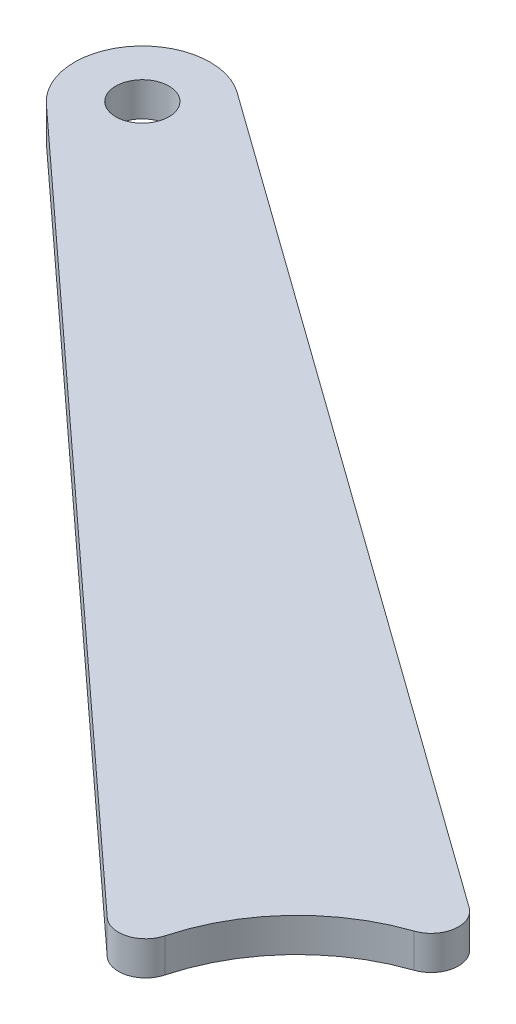
ISO-10303-21;
HEADER;
FILE_DESCRIPTION(('STEP AP214'),'2;1');
FILE_NAME('part.step','',(''),(''),'','','');
FILE_SCHEMA(('AUTOMOTIVE_DESIGN { 1 0 10303 214 1 1 1 1 }'));
ENDSEC;
DATA;
#1=APPLICATION_CONTEXT('core data for automotive mechanical design processes');
#2=APPLICATION_PROTOCOL_DEFINITION('international standard','automotive_design',2000,#1);
#3=PRODUCT_CONTEXT('',#1,'mechanical');
#4=PRODUCT('Part','Part','',(#3));
#5=PRODUCT_RELATED_PRODUCT_CATEGORY('part','',(#4));
#6=PRODUCT_DEFINITION_FORMATION('','',#4);
#7=PRODUCT_DEFINITION_CONTEXT('part definition',#1,'design');
#8=PRODUCT_DEFINITION('design','',#6,#7);
#9=PRODUCT_DEFINITION_SHAPE('','',#8);
#10=(LENGTH_UNIT() NAMED_UNIT(*) SI_UNIT(.MILLI.,.METRE.));
#11=(NAMED_UNIT(*) PLANE_ANGLE_UNIT() SI_UNIT($,.RADIAN.));
#12=(NAMED_UNIT(*) SI_UNIT($,.STERADIAN.) SOLID_ANGLE_UNIT());
#13=UNCERTAINTY_MEASURE_WITH_UNIT(LENGTH_MEASURE(1.E-05),#10,'distance_accuracy_value','');
#14=(GEOMETRIC_REPRESENTATION_CONTEXT(3) GLOBAL_UNCERTAINTY_ASSIGNED_CONTEXT((#13)) GLOBAL_UNIT_ASSIGNED_CONTEXT((#10,
#11,#12)) REPRESENTATION_CONTEXT('',''));
#15=CARTESIAN_POINT('',(0.,0.,0.));
#16=DIRECTION('',(0.,0.,1.));
#17=DIRECTION('',(1.,0.,0.));
#18=AXIS2_PLACEMENT_3D('',#15,#16,#17);
#19=CARTESIAN_POINT('',(-102.921960951703,3.175,-134.482288991755));
#20=DIRECTION('',(0.,1.,0.));
#21=DIRECTION('',(0.,0.,1.));
#22=AXIS2_PLACEMENT_3D('',#19,#20,#21);
#23=PLANE('',#22);
#24=CARTESIAN_POINT('',(-102.921960951703,3.175,-134.482288991755));
#25=DIRECTION('',(0.,1.,0.));
#26=DIRECTION('',(0.,0.,1.));
#27=AXIS2_PLACEMENT_3D('',#24,#25,#26);
#28=CIRCLE('',#27,6.34999999999998);
#29=CARTESIAN_POINT('',(-99.2193740859753,3.175,-139.641101888317));
#30=VERTEX_POINT('',#29);
#31=CARTESIAN_POINT('',(-107.214132468825,3.175,-129.802570659675));
#32=VERTEX_POINT('',#31);
#33=EDGE_CURVE('E135',#30,#32,#28,.T.);
#34=ORIENTED_EDGE('',*,*,#33,.T.);
#35=DIRECTION('',(0.736963516863045,0.,0.675932522381379));
#36=VECTOR('',#35,1.);
#37=CARTESIAN_POINT('',(-107.214132468825,3.175,-129.802570659675));
#38=LINE('',#37,#36);
#39=CARTESIAN_POINT('',(-38.5058667050716,3.175,-66.7843203345713));
#40=VERTEX_POINT('',#39);
#41=EDGE_CURVE('E93',#32,#40,#38,.T.);
#42=ORIENTED_EDGE('',*,*,#41,.T.);
#43=CARTESIAN_POINT('',(-36.7889980982229,3.175,-68.6562076674035));
#44=DIRECTION('',(0.,1.,0.));
#45=DIRECTION('',(0.,0.,1.));
#46=AXIS2_PLACEMENT_3D('',#43,#44,#45);
#47=CIRCLE('',#46,2.53999999999999);
#48=CARTESIAN_POINT('',(-34.3348396095597,3.175,-68.0014511382094));
#49=VERTEX_POINT('',#48);
#50=EDGE_CURVE('E106',#40,#49,#47,.T.);
#51=ORIENTED_EDGE('',*,*,#50,.T.);
#52=CARTESIAN_POINT('',(-17.4625000000001,3.175,-63.5));
#53=DIRECTION('',(0.,-1.,0.));
#54=DIRECTION('',(0.,0.,1.));
#55=AXIS2_PLACEMENT_3D('',#52,#53,#54);
#56=CIRCLE('',#55,17.4625);
#57=CARTESIAN_POINT('',(-23.0676345839141,3.175,-80.0384815671273));
#58=VERTEX_POINT('',#57);
#59=EDGE_CURVE('E100',#49,#58,#56,.T.);
#60=ORIENTED_EDGE('',*,*,#59,.T.);
#61=CARTESIAN_POINT('',(-23.8829268870289,3.175,-82.4440788859822));
#62=DIRECTION('',(0.,1.,0.));
#63=DIRECTION('',(0.,0.,1.));
#64=AXIS2_PLACEMENT_3D('',#61,#62,#63);
#65=CIRCLE('',#64,2.54);
#66=CARTESIAN_POINT('',(-22.4018921407378,3.175,-84.5076040446072));
#67=VERTEX_POINT('',#66);
#68=EDGE_CURVE('E104',#58,#67,#65,.T.);
#69=ORIENTED_EDGE('',*,*,#68,.T.);
#70=DIRECTION('',(-0.812411479773612,0.,-0.583084545783928));
#71=VECTOR('',#70,1.);
#72=CARTESIAN_POINT('',(-99.2193740859753,3.175,-139.641101888317));
#73=LINE('',#72,#71);
#74=EDGE_CURVE('E56',#67,#30,#73,.T.);
#75=ORIENTED_EDGE('',*,*,#74,.T.);
#76=EDGE_LOOP('',(#34,#42,#51,#60,#69,#75));
#77=FACE_BOUND('',#76,.T.);
#78=CARTESIAN_POINT('',(-102.921960951703,3.175,-134.482288991755));
#79=DIRECTION('',(0.,1.,0.));
#80=DIRECTION('',(0.,0.,1.));
#81=AXIS2_PLACEMENT_3D('',#78,#79,#80);
#82=CIRCLE('',#81,2.48920000000002);
#83=CARTESIAN_POINT('',(-102.921960951703,3.175,-131.993088991755));
#84=VERTEX_POINT('',#83);
#85=EDGE_CURVE('E128',#84,#84,#82,.T.);
#86=ORIENTED_EDGE('',*,*,#85,.F.);
#87=EDGE_LOOP('',(#86));
#88=FACE_BOUND('',#87,.T.);
#89=ADVANCED_FACE('F39',(#77,#88),#23,.T.);
#90=CARTESIAN_POINT('',(-102.921960951703,0.,-134.482288991755));
#91=DIRECTION('',(0.,1.,0.));
#92=DIRECTION('',(0.,0.,1.));
#93=AXIS2_PLACEMENT_3D('',#90,#91,#92);
#94=PLANE('',#93);
#95=CARTESIAN_POINT('',(-102.921960951703,0.,-134.482288991755));
#96=DIRECTION('',(0.,1.,0.));
#97=DIRECTION('',(0.,0.,1.));
#98=AXIS2_PLACEMENT_3D('',#95,#96,#97);
#99=CIRCLE('',#98,6.34999999999998);
#100=CARTESIAN_POINT('',(-99.2193740859753,0.,-139.641101888317));
#101=VERTEX_POINT('',#100);
#102=CARTESIAN_POINT('',(-107.214132468825,0.,-129.802570659675));
#103=VERTEX_POINT('',#102);
#104=EDGE_CURVE('E124',#101,#103,#99,.T.);
#105=ORIENTED_EDGE('',*,*,#104,.F.);
#106=DIRECTION('',(-0.812411479773612,0.,-0.583084545783928));
#107=VECTOR('',#106,1.);
#108=CARTESIAN_POINT('',(-99.2193740859753,0.,-139.641101888317));
#109=LINE('',#108,#107);
#110=CARTESIAN_POINT('',(-22.4018921407378,0.,-84.5076040446072));
#111=VERTEX_POINT('',#110);
#112=EDGE_CURVE('E85',#111,#101,#109,.T.);
#113=ORIENTED_EDGE('',*,*,#112,.F.);
#114=CARTESIAN_POINT('',(-23.8829268870289,0.,-82.4440788859822));
#115=DIRECTION('',(0.,1.,0.));
#116=DIRECTION('',(0.,0.,1.));
#117=AXIS2_PLACEMENT_3D('',#114,#115,#116);
#118=CIRCLE('',#117,2.54);
#119=CARTESIAN_POINT('',(-23.0676345839141,0.,-80.0384815671273));
#120=VERTEX_POINT('',#119);
#121=EDGE_CURVE('E79',#120,#111,#118,.T.);
#122=ORIENTED_EDGE('',*,*,#121,.F.);
#123=CARTESIAN_POINT('',(-17.4625000000001,0.,-63.5));
#124=DIRECTION('',(0.,-1.,0.));
#125=DIRECTION('',(0.,0.,1.));
#126=AXIS2_PLACEMENT_3D('',#123,#124,#125);
#127=CIRCLE('',#126,17.4625);
#128=CARTESIAN_POINT('',(-34.3348396095597,0.,-68.0014511382094));
#129=VERTEX_POINT('',#128);
#130=EDGE_CURVE('E114',#129,#120,#127,.T.);
#131=ORIENTED_EDGE('',*,*,#130,.F.);
#132=CARTESIAN_POINT('',(-36.7889980982229,0.,-68.6562076674035));
#133=DIRECTION('',(0.,1.,0.));
#134=DIRECTION('',(0.,0.,1.));
#135=AXIS2_PLACEMENT_3D('',#132,#133,#134);
#136=CIRCLE('',#135,2.53999999999999);
#137=CARTESIAN_POINT('',(-38.5058667050716,0.,-66.7843203345713));
#138=VERTEX_POINT('',#137);
#139=EDGE_CURVE('E130',#138,#129,#136,.T.);
#140=ORIENTED_EDGE('',*,*,#139,.F.);
#141=DIRECTION('',(0.736963516863045,0.,0.675932522381379));
#142=VECTOR('',#141,1.);
#143=CARTESIAN_POINT('',(-107.214132468825,0.,-129.802570659675));
#144=LINE('',#143,#142);
#145=EDGE_CURVE('E127',#103,#138,#144,.T.);
#146=ORIENTED_EDGE('',*,*,#145,.F.);
#147=EDGE_LOOP('',(#105,#113,#122,#131,#140,#146));
#148=FACE_BOUND('',#147,.T.);
#149=CARTESIAN_POINT('',(-102.921960951703,0.,-134.482288991755));
#150=DIRECTION('',(0.,1.,0.));
#151=DIRECTION('',(0.,0.,1.));
#152=AXIS2_PLACEMENT_3D('',#149,#150,#151);
#153=CIRCLE('',#152,2.48920000000002);
#154=CARTESIAN_POINT('',(-102.921960951703,0.,-131.993088991755));
#155=VERTEX_POINT('',#154);
#156=EDGE_CURVE('E228',#155,#155,#153,.T.);
#157=ORIENTED_EDGE('',*,*,#156,.T.);
#158=EDGE_LOOP('',(#157));
#159=FACE_BOUND('',#158,.T.);
#160=ADVANCED_FACE('F144',(#148,#159),#94,.F.);
#161=CARTESIAN_POINT('',(-102.921960951703,3.175,-134.482288991755));
#162=DIRECTION('',(0.,-1.,0.));
#163=DIRECTION('',(0.,0.,-1.));
#164=AXIS2_PLACEMENT_3D('',#161,#162,#163);
#165=CYLINDRICAL_SURFACE('',#164,6.34999999999998);
#166=ORIENTED_EDGE('',*,*,#104,.T.);
#167=DIRECTION('',(0.,-1.,0.));
#168=VECTOR('',#167,1.);
#169=CARTESIAN_POINT('',(-107.214132468825,3.175,-129.802570659675));
#170=LINE('',#169,#168);
#171=EDGE_CURVE('E11',#32,#103,#170,.T.);
#172=ORIENTED_EDGE('',*,*,#171,.F.);
#173=ORIENTED_EDGE('',*,*,#33,.F.);
#174=DIRECTION('',(0.,-1.,0.));
#175=VECTOR('',#174,1.);
#176=CARTESIAN_POINT('',(-99.2193740859753,3.175,-139.641101888317));
#177=LINE('',#176,#175);
#178=EDGE_CURVE('E120',#30,#101,#177,.T.);
#179=ORIENTED_EDGE('',*,*,#178,.T.);
#180=EDGE_LOOP('',(#166,#172,#173,#179));
#181=FACE_BOUND('',#180,.T.);
#182=ADVANCED_FACE('F41',(#181),#165,.T.);
#183=CARTESIAN_POINT('',(-107.214132468825,3.175,-129.802570659675));
#184=DIRECTION('',(0.675932522381379,0.,-0.736963516863045));
#185=DIRECTION('',(-0.736963516863045,0.,-0.675932522381379));
#186=AXIS2_PLACEMENT_3D('',#183,#184,#185);
#187=PLANE('',#186);
#188=ORIENTED_EDGE('',*,*,#145,.T.);
#189=DIRECTION('',(0.,-1.,0.));
#190=VECTOR('',#189,1.);
#191=CARTESIAN_POINT('',(-38.5058667050716,3.175,-66.7843203345713));
#192=LINE('',#191,#190);
#193=EDGE_CURVE('E48',#40,#138,#192,.T.);
#194=ORIENTED_EDGE('',*,*,#193,.F.);
#195=ORIENTED_EDGE('',*,*,#41,.F.);
#196=ORIENTED_EDGE('',*,*,#171,.T.);
#197=EDGE_LOOP('',(#188,#194,#195,#196));
#198=FACE_BOUND('',#197,.T.);
#199=ADVANCED_FACE('F169',(#198),#187,.F.);
#200=CARTESIAN_POINT('',(-36.7889980982229,3.175,-68.6562076674035));
#201=DIRECTION('',(0.,-1.,0.));
#202=DIRECTION('',(0.,0.,-1.));
#203=AXIS2_PLACEMENT_3D('',#200,#201,#202);
#204=CYLINDRICAL_SURFACE('',#203,2.53999999999999);
#205=ORIENTED_EDGE('',*,*,#139,.T.);
#206=DIRECTION('',(0.,-1.,0.));
#207=VECTOR('',#206,1.);
#208=CARTESIAN_POINT('',(-34.3348396095597,3.175,-68.0014511382094));
#209=LINE('',#208,#207);
#210=EDGE_CURVE('E115',#49,#129,#209,.T.);
#211=ORIENTED_EDGE('',*,*,#210,.F.);
#212=ORIENTED_EDGE('',*,*,#50,.F.);
#213=ORIENTED_EDGE('',*,*,#193,.T.);
#214=EDGE_LOOP('',(#205,#211,#212,#213));
#215=FACE_BOUND('',#214,.T.);
#216=ADVANCED_FACE('F141',(#215),#204,.T.);
#217=CARTESIAN_POINT('',(-17.4625000000001,3.175,-63.5));
#218=DIRECTION('',(0.,-1.,0.));
#219=DIRECTION('',(0.,0.,-1.));
#220=AXIS2_PLACEMENT_3D('',#217,#218,#219);
#221=CYLINDRICAL_SURFACE('',#220,17.4625);
#222=ORIENTED_EDGE('',*,*,#130,.T.);
#223=DIRECTION('',(0.,-1.,0.));
#224=VECTOR('',#223,1.);
#225=CARTESIAN_POINT('',(-23.0676345839141,3.175,-80.0384815671273));
#226=LINE('',#225,#224);
#227=EDGE_CURVE('E111',#58,#120,#226,.T.);
#228=ORIENTED_EDGE('',*,*,#227,.F.);
#229=ORIENTED_EDGE('',*,*,#59,.F.);
#230=ORIENTED_EDGE('',*,*,#210,.T.);
#231=EDGE_LOOP('',(#222,#228,#229,#230));
#232=FACE_BOUND('',#231,.T.);
#233=ADVANCED_FACE('F112',(#232),#221,.F.);
#234=CARTESIAN_POINT('',(-23.8829268870289,3.175,-82.4440788859822));
#235=DIRECTION('',(0.,-1.,0.));
#236=DIRECTION('',(0.,0.,-1.));
#237=AXIS2_PLACEMENT_3D('',#234,#235,#236);
#238=CYLINDRICAL_SURFACE('',#237,2.54);
#239=ORIENTED_EDGE('',*,*,#121,.T.);
#240=DIRECTION('',(0.,-1.,0.));
#241=VECTOR('',#240,1.);
#242=CARTESIAN_POINT('',(-22.4018921407378,3.175,-84.5076040446072));
#243=LINE('',#242,#241);
#244=EDGE_CURVE('E116',#67,#111,#243,.T.);
#245=ORIENTED_EDGE('',*,*,#244,.F.);
#246=ORIENTED_EDGE('',*,*,#68,.F.);
#247=ORIENTED_EDGE('',*,*,#227,.T.);
#248=EDGE_LOOP('',(#239,#245,#246,#247));
#249=FACE_BOUND('',#248,.T.);
#250=ADVANCED_FACE('F118',(#249),#238,.T.);
#251=CARTESIAN_POINT('',(-99.2193740859753,3.175,-139.641101888317));
#252=DIRECTION('',(-0.583084545783928,0.,0.812411479773612));
#253=DIRECTION('',(0.812411479773612,0.,0.583084545783929));
#254=AXIS2_PLACEMENT_3D('',#251,#252,#253);
#255=PLANE('',#254);
#256=ORIENTED_EDGE('',*,*,#112,.T.);
#257=ORIENTED_EDGE('',*,*,#178,.F.);
#258=ORIENTED_EDGE('',*,*,#74,.F.);
#259=ORIENTED_EDGE('',*,*,#244,.T.);
#260=EDGE_LOOP('',(#256,#257,#258,#259));
#261=FACE_BOUND('',#260,.T.);
#262=ADVANCED_FACE('F149',(#261),#255,.F.);
#263=CARTESIAN_POINT('',(-102.921960951703,3.175,-134.482288991755));
#264=DIRECTION('',(0.,-1.,0.));
#265=DIRECTION('',(0.,0.,-1.));
#266=AXIS2_PLACEMENT_3D('',#263,#264,#265);
#267=CYLINDRICAL_SURFACE('',#266,2.48920000000002);
#268=ORIENTED_EDGE('',*,*,#85,.T.);
#269=EDGE_LOOP('',(#268));
#270=FACE_BOUND('',#269,.T.);
#271=ORIENTED_EDGE('',*,*,#156,.F.);
#272=EDGE_LOOP('',(#271));
#273=FACE_BOUND('',#272,.T.);
#274=ADVANCED_FACE('F151',(#270,#273),#267,.F.);
#275=CLOSED_SHELL('',(#89,#160,#182,#199,#216,#233,#250,#262,#274));
#276=MANIFOLD_SOLID_BREP('B2',#275);
#277=ADVANCED_BREP_SHAPE_REPRESENTATION('',(#18,#276),#14);
#278=SHAPE_DEFINITION_REPRESENTATION(#9,#277);
ENDSEC;
END-ISO-10303-21;
